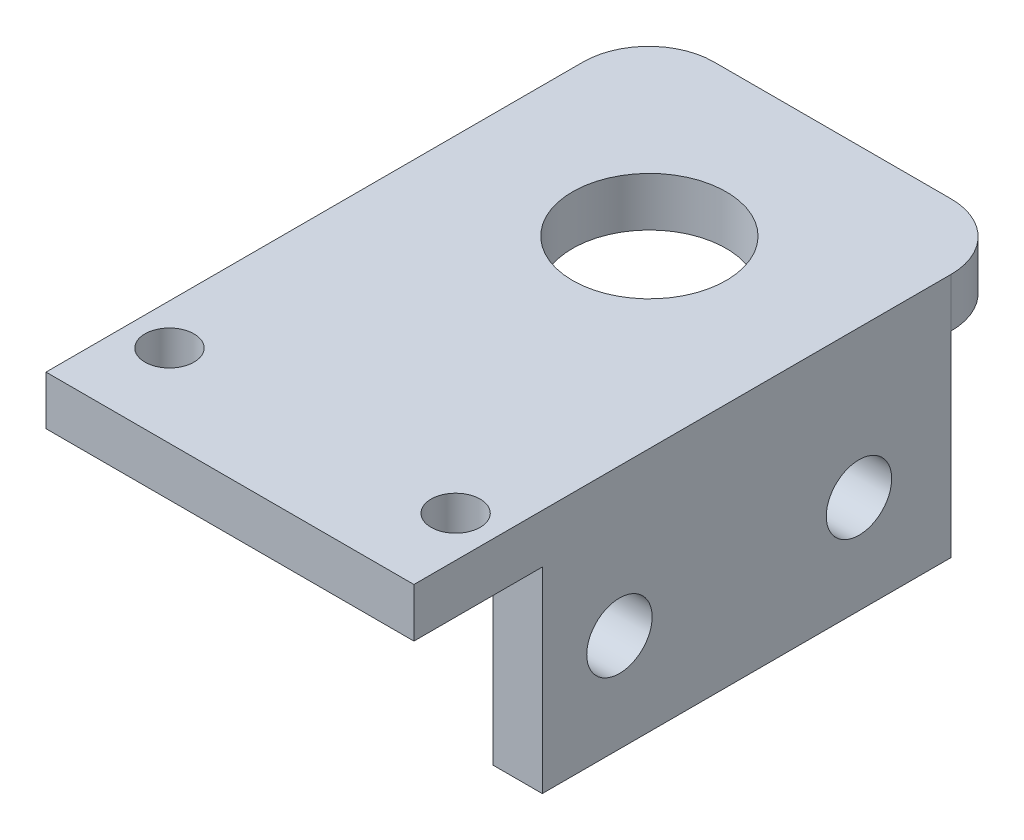
ISO-10303-21;
HEADER;
FILE_DESCRIPTION(('STEP AP214'),'2;1');
FILE_NAME('part.step','',(''),(''),'','','');
FILE_SCHEMA(('AUTOMOTIVE_DESIGN { 1 0 10303 214 1 1 1 1 }'));
ENDSEC;
DATA;
#1=APPLICATION_CONTEXT('core data for automotive mechanical design processes');
#2=APPLICATION_PROTOCOL_DEFINITION('international standard','automotive_design',2000,#1);
#3=PRODUCT_CONTEXT('',#1,'mechanical');
#4=PRODUCT('Part','Part','',(#3));
#5=PRODUCT_RELATED_PRODUCT_CATEGORY('part','',(#4));
#6=PRODUCT_DEFINITION_FORMATION('','',#4);
#7=PRODUCT_DEFINITION_CONTEXT('part definition',#1,'design');
#8=PRODUCT_DEFINITION('design','',#6,#7);
#9=PRODUCT_DEFINITION_SHAPE('','',#8);
#10=(LENGTH_UNIT() NAMED_UNIT(*) SI_UNIT(.MILLI.,.METRE.));
#11=(NAMED_UNIT(*) PLANE_ANGLE_UNIT() SI_UNIT($,.RADIAN.));
#12=(NAMED_UNIT(*) SI_UNIT($,.STERADIAN.) SOLID_ANGLE_UNIT());
#13=UNCERTAINTY_MEASURE_WITH_UNIT(LENGTH_MEASURE(1.E-05),#10,'distance_accuracy_value','');
#14=(GEOMETRIC_REPRESENTATION_CONTEXT(3) GLOBAL_UNCERTAINTY_ASSIGNED_CONTEXT((#13)) GLOBAL_UNIT_ASSIGNED_CONTEXT((#10,
#11,#12)) REPRESENTATION_CONTEXT('',''));
#15=CARTESIAN_POINT('',(0.,0.,0.));
#16=DIRECTION('',(0.,0.,1.));
#17=DIRECTION('',(1.,0.,0.));
#18=AXIS2_PLACEMENT_3D('',#15,#16,#17);
#19=CARTESIAN_POINT('',(21.0454809291478,3.,0.));
#20=DIRECTION('',(-1.,0.,0.));
#21=DIRECTION('',(0.,0.,1.));
#22=AXIS2_PLACEMENT_3D('',#19,#20,#21);
#23=PLANE('',#22);
#24=DIRECTION('',(0.,0.,-1.));
#25=VECTOR('',#24,1.);
#26=CARTESIAN_POINT('',(21.0454809291478,0.,0.));
#27=LINE('',#26,#25);
#28=CARTESIAN_POINT('',(21.0454809291478,0.,19.8927227898984));
#29=VERTEX_POINT('',#28);
#30=CARTESIAN_POINT('',(21.0454809291478,0.,12.0427227898984));
#31=VERTEX_POINT('',#30);
#32=EDGE_CURVE('E268',#29,#31,#27,.T.);
#33=ORIENTED_EDGE('',*,*,#32,.T.);
#34=DIRECTION('',(0.,-1.,0.));
#35=VECTOR('',#34,1.);
#36=CARTESIAN_POINT('',(21.0454809291478,0.,12.0427227898984));
#37=LINE('',#36,#35);
#38=CARTESIAN_POINT('',(21.0454809291478,-12.,12.0427227898984));
#39=VERTEX_POINT('',#38);
#40=EDGE_CURVE('E203',#31,#39,#37,.T.);
#41=ORIENTED_EDGE('',*,*,#40,.T.);
#42=DIRECTION('',(0.,0.,1.));
#43=VECTOR('',#42,1.);
#44=CARTESIAN_POINT('',(21.0454809291478,-12.,0.));
#45=LINE('',#44,#43);
#46=CARTESIAN_POINT('',(21.0454809291478,-12.,-12.9572772101016));
#47=VERTEX_POINT('',#46);
#48=EDGE_CURVE('E190',#47,#39,#45,.T.);
#49=ORIENTED_EDGE('',*,*,#48,.F.);
#50=DIRECTION('',(0.,-1.,0.));
#51=VECTOR('',#50,1.);
#52=CARTESIAN_POINT('',(21.0454809291478,0.,-12.9572772101016));
#53=LINE('',#52,#51);
#54=CARTESIAN_POINT('',(21.0454809291478,0.,-12.9572772101016));
#55=VERTEX_POINT('',#54);
#56=EDGE_CURVE('E177',#55,#47,#53,.T.);
#57=ORIENTED_EDGE('',*,*,#56,.F.);
#58=DIRECTION('',(0.,-1.,0.));
#59=VECTOR('',#58,1.);
#60=CARTESIAN_POINT('',(21.0454809291478,3.,-12.9572772101016));
#61=LINE('',#60,#59);
#62=CARTESIAN_POINT('',(21.0454809291478,3.,-12.9572772101016));
#63=VERTEX_POINT('',#62);
#64=EDGE_CURVE('E11',#63,#55,#61,.T.);
#65=ORIENTED_EDGE('',*,*,#64,.F.);
#66=DIRECTION('',(0.,0.,-1.));
#67=VECTOR('',#66,1.);
#68=CARTESIAN_POINT('',(21.0454809291478,3.,0.));
#69=LINE('',#68,#67);
#70=CARTESIAN_POINT('',(21.0454809291478,3.,19.8927227898984));
#71=VERTEX_POINT('',#70);
#72=EDGE_CURVE('E237',#71,#63,#69,.T.);
#73=ORIENTED_EDGE('',*,*,#72,.F.);
#74=DIRECTION('',(0.,-1.,0.));
#75=VECTOR('',#74,1.);
#76=CARTESIAN_POINT('',(21.0454809291478,3.,19.8927227898984));
#77=LINE('',#76,#75);
#78=EDGE_CURVE('E256',#71,#29,#77,.T.);
#79=ORIENTED_EDGE('',*,*,#78,.T.);
#80=EDGE_LOOP('',(#33,#41,#49,#57,#65,#73,#79));
#81=FACE_BOUND('',#80,.T.);
#82=CARTESIAN_POINT('',(21.0454809291478,-6.,-7.32401908619473));
#83=DIRECTION('',(-1.,0.,0.));
#84=DIRECTION('',(0.,0.,1.));
#85=AXIS2_PLACEMENT_3D('',#82,#83,#84);
#86=CIRCLE('',#85,2.);
#87=CARTESIAN_POINT('',(21.0454809291478,-6.,-5.32401908619473));
#88=VERTEX_POINT('',#87);
#89=EDGE_CURVE('E182',#88,#88,#86,.F.);
#90=ORIENTED_EDGE('',*,*,#89,.F.);
#91=EDGE_LOOP('',(#90));
#92=FACE_BOUND('',#91,.T.);
#93=CARTESIAN_POINT('',(21.0454809291478,-6.,7.32401908619473));
#94=DIRECTION('',(-1.,0.,0.));
#95=DIRECTION('',(0.,0.,1.));
#96=AXIS2_PLACEMENT_3D('',#93,#94,#95);
#97=CIRCLE('',#96,2.);
#98=CARTESIAN_POINT('',(21.0454809291478,-6.,9.32401908619473));
#99=VERTEX_POINT('',#98);
#100=EDGE_CURVE('E173',#99,#99,#97,.T.);
#101=ORIENTED_EDGE('',*,*,#100,.T.);
#102=EDGE_LOOP('',(#101));
#103=FACE_BOUND('',#102,.T.);
#104=ADVANCED_FACE('F44',(#81,#92,#103),#23,.F.);
#105=CARTESIAN_POINT('',(18.0454809291478,0.,0.));
#106=DIRECTION('',(1.,0.,0.));
#107=DIRECTION('',(0.,0.,-1.));
#108=AXIS2_PLACEMENT_3D('',#105,#106,#107);
#109=PLANE('',#108);
#110=DIRECTION('',(0.,0.,-1.));
#111=VECTOR('',#110,1.);
#112=CARTESIAN_POINT('',(18.0454809291478,0.,0.));
#113=LINE('',#112,#111);
#114=CARTESIAN_POINT('',(18.0454809291478,0.,12.0427227898984));
#115=VERTEX_POINT('',#114);
#116=CARTESIAN_POINT('',(18.0454809291478,0.,3.54272278989844));
#117=VERTEX_POINT('',#116);
#118=EDGE_CURVE('E147',#115,#117,#113,.T.);
#119=ORIENTED_EDGE('',*,*,#118,.T.);
#120=DIRECTION('',(0.,1.,0.));
#121=VECTOR('',#120,1.);
#122=CARTESIAN_POINT('',(18.0454809291478,0.,3.54272278989844));
#123=LINE('',#122,#121);
#124=CARTESIAN_POINT('',(18.0454809291478,-4.6412135438896,3.54272278989844));
#125=VERTEX_POINT('',#124);
#126=EDGE_CURVE('E60',#125,#117,#123,.T.);
#127=ORIENTED_EDGE('',*,*,#126,.F.);
#128=DIRECTION('',(0.,0.,-1.));
#129=VECTOR('',#128,1.);
#130=CARTESIAN_POINT('',(18.0454809291478,-4.6412135438896,3.54272278989844));
#131=LINE('',#130,#129);
#132=CARTESIAN_POINT('',(18.0454809291478,-4.6412135438896,0.542722789898435));
#133=VERTEX_POINT('',#132);
#134=EDGE_CURVE('E65',#125,#133,#131,.T.);
#135=ORIENTED_EDGE('',*,*,#134,.T.);
#136=DIRECTION('',(0.,1.,0.));
#137=VECTOR('',#136,1.);
#138=CARTESIAN_POINT('',(18.0454809291478,0.,0.542722789898435));
#139=LINE('',#138,#137);
#140=CARTESIAN_POINT('',(18.0454809291478,0.,0.542722789898435));
#141=VERTEX_POINT('',#140);
#142=EDGE_CURVE('E151',#133,#141,#139,.T.);
#143=ORIENTED_EDGE('',*,*,#142,.T.);
#144=CARTESIAN_POINT('',(18.0454809291478,0.,-12.9572772101016));
#145=VERTEX_POINT('',#144);
#146=EDGE_CURVE('E137',#141,#145,#113,.T.);
#147=ORIENTED_EDGE('',*,*,#146,.T.);
#148=DIRECTION('',(0.,-1.,0.));
#149=VECTOR('',#148,1.);
#150=CARTESIAN_POINT('',(18.0454809291478,0.,-12.9572772101016));
#151=LINE('',#150,#149);
#152=CARTESIAN_POINT('',(18.0454809291478,-12.,-12.9572772101016));
#153=VERTEX_POINT('',#152);
#154=EDGE_CURVE('E148',#145,#153,#151,.T.);
#155=ORIENTED_EDGE('',*,*,#154,.T.);
#156=DIRECTION('',(0.,0.,1.));
#157=VECTOR('',#156,1.);
#158=CARTESIAN_POINT('',(18.0454809291478,-12.,0.));
#159=LINE('',#158,#157);
#160=CARTESIAN_POINT('',(18.0454809291478,-12.,12.0427227898984));
#161=VERTEX_POINT('',#160);
#162=EDGE_CURVE('E197',#153,#161,#159,.T.);
#163=ORIENTED_EDGE('',*,*,#162,.T.);
#164=DIRECTION('',(0.,-1.,0.));
#165=VECTOR('',#164,1.);
#166=CARTESIAN_POINT('',(18.0454809291478,0.,12.0427227898984));
#167=LINE('',#166,#165);
#168=EDGE_CURVE('E193',#115,#161,#167,.T.);
#169=ORIENTED_EDGE('',*,*,#168,.F.);
#170=EDGE_LOOP('',(#119,#127,#135,#143,#147,#155,#163,#169));
#171=FACE_BOUND('',#170,.T.);
#172=CARTESIAN_POINT('',(18.0454809291478,-6.,-7.32401908619473));
#173=DIRECTION('',(-1.,0.,0.));
#174=DIRECTION('',(0.,0.,1.));
#175=AXIS2_PLACEMENT_3D('',#172,#173,#174);
#176=CIRCLE('',#175,2.);
#177=CARTESIAN_POINT('',(18.0454809291478,-6.,-5.32401908619473));
#178=VERTEX_POINT('',#177);
#179=EDGE_CURVE('E172',#178,#178,#176,.F.);
#180=ORIENTED_EDGE('',*,*,#179,.T.);
#181=EDGE_LOOP('',(#180));
#182=FACE_BOUND('',#181,.T.);
#183=CARTESIAN_POINT('',(18.0454809291478,-6.,7.32401908619473));
#184=DIRECTION('',(-1.,0.,0.));
#185=DIRECTION('',(0.,0.,1.));
#186=AXIS2_PLACEMENT_3D('',#183,#184,#185);
#187=CIRCLE('',#186,2.);
#188=CARTESIAN_POINT('',(18.0454809291478,-6.,9.32401908619473));
#189=VERTEX_POINT('',#188);
#190=EDGE_CURVE('E178',#189,#189,#187,.T.);
#191=ORIENTED_EDGE('',*,*,#190,.F.);
#192=EDGE_LOOP('',(#191));
#193=FACE_BOUND('',#192,.T.);
#194=ADVANCED_FACE('F152',(#171,#182,#193),#109,.F.);
#195=CARTESIAN_POINT('',(0.,0.,0.));
#196=DIRECTION('',(0.,1.,0.));
#197=DIRECTION('',(0.,0.,1.));
#198=AXIS2_PLACEMENT_3D('',#195,#196,#197);
#199=PLANE('',#198);
#200=CARTESIAN_POINT('',(18.5454809291478,0.,14.8427227898984));
#201=DIRECTION('',(0.,1.,0.));
#202=DIRECTION('',(0.,0.,1.));
#203=AXIS2_PLACEMENT_3D('',#200,#201,#202);
#204=CIRCLE('',#203,1.5);
#205=CARTESIAN_POINT('',(18.5454809291478,0.,16.3427227898984));
#206=VERTEX_POINT('',#205);
#207=EDGE_CURVE('E264',#206,#206,#204,.T.);
#208=ORIENTED_EDGE('',*,*,#207,.T.);
#209=EDGE_LOOP('',(#208));
#210=FACE_BOUND('',#209,.T.);
#211=CARTESIAN_POINT('',(1.04548092914784,0.,14.8427227898984));
#212=DIRECTION('',(0.,1.,0.));
#213=DIRECTION('',(0.,0.,1.));
#214=AXIS2_PLACEMENT_3D('',#211,#212,#213);
#215=CIRCLE('',#214,1.5);
#216=CARTESIAN_POINT('',(1.04548092914784,0.,16.3427227898984));
#217=VERTEX_POINT('',#216);
#218=EDGE_CURVE('E260',#217,#217,#215,.T.);
#219=ORIENTED_EDGE('',*,*,#218,.T.);
#220=EDGE_LOOP('',(#219));
#221=FACE_BOUND('',#220,.T.);
#222=CARTESIAN_POINT('',(9.79548092914784,0.,-5.75727721010157));
#223=DIRECTION('',(0.,1.,0.));
#224=DIRECTION('',(0.,0.,1.));
#225=AXIS2_PLACEMENT_3D('',#222,#223,#224);
#226=CIRCLE('',#225,4.7);
#227=CARTESIAN_POINT('',(9.79548092914784,0.,-1.05727721010157));
#228=VERTEX_POINT('',#227);
#229=EDGE_CURVE('E214',#228,#228,#226,.T.);
#230=ORIENTED_EDGE('',*,*,#229,.T.);
#231=EDGE_LOOP('',(#230));
#232=FACE_BOUND('',#231,.T.);
#233=DIRECTION('',(0.,0.,-1.));
#234=VECTOR('',#233,1.);
#235=CARTESIAN_POINT('',(11.0111979585973,0.,3.54272278989844));
#236=LINE('',#235,#234);
#237=CARTESIAN_POINT('',(11.0111979585973,0.,3.54272278989844));
#238=VERTEX_POINT('',#237);
#239=CARTESIAN_POINT('',(11.0111979585973,0.,0.542722789898435));
#240=VERTEX_POINT('',#239);
#241=EDGE_CURVE('E168',#238,#240,#236,.T.);
#242=ORIENTED_EDGE('',*,*,#241,.F.);
#243=DIRECTION('',(-1.,0.,0.));
#244=VECTOR('',#243,1.);
#245=CARTESIAN_POINT('',(11.0111979585973,0.,3.54272278989844));
#246=LINE('',#245,#244);
#247=EDGE_CURVE('E410',#117,#238,#246,.T.);
#248=ORIENTED_EDGE('',*,*,#247,.F.);
#249=ORIENTED_EDGE('',*,*,#118,.F.);
#250=DIRECTION('',(1.,0.,0.));
#251=VECTOR('',#250,1.);
#252=CARTESIAN_POINT('',(18.0454809291478,0.,12.0427227898984));
#253=LINE('',#252,#251);
#254=EDGE_CURVE('E218',#115,#31,#253,.T.);
#255=ORIENTED_EDGE('',*,*,#254,.T.);
#256=ORIENTED_EDGE('',*,*,#32,.F.);
#257=DIRECTION('',(1.,0.,0.));
#258=VECTOR('',#257,1.);
#259=CARTESIAN_POINT('',(0.,0.,19.8927227898984));
#260=LINE('',#259,#258);
#261=CARTESIAN_POINT('',(-1.45451907085216,0.,19.8927227898984));
#262=VERTEX_POINT('',#261);
#263=EDGE_CURVE('E229',#262,#29,#260,.T.);
#264=ORIENTED_EDGE('',*,*,#263,.F.);
#265=DIRECTION('',(0.,0.,1.));
#266=VECTOR('',#265,1.);
#267=CARTESIAN_POINT('',(-1.45451907085216,0.,0.));
#268=LINE('',#267,#266);
#269=CARTESIAN_POINT('',(-1.45451907085216,0.,-12.9572772101016));
#270=VERTEX_POINT('',#269);
#271=EDGE_CURVE('E281',#270,#262,#268,.T.);
#272=ORIENTED_EDGE('',*,*,#271,.F.);
#273=CARTESIAN_POINT('',(2.54548092914784,0.,-12.9572772101016));
#274=DIRECTION('',(0.,1.,0.));
#275=DIRECTION('',(0.,0.,1.));
#276=AXIS2_PLACEMENT_3D('',#273,#274,#275);
#277=CIRCLE('',#276,4.);
#278=CARTESIAN_POINT('',(2.54548092914784,0.,-16.9572772101016));
#279=VERTEX_POINT('',#278);
#280=EDGE_CURVE('E278',#279,#270,#277,.T.);
#281=ORIENTED_EDGE('',*,*,#280,.F.);
#282=DIRECTION('',(-1.,0.,0.));
#283=VECTOR('',#282,1.);
#284=CARTESIAN_POINT('',(0.,0.,-16.9572772101016));
#285=LINE('',#284,#283);
#286=CARTESIAN_POINT('',(17.0454809291478,0.,-16.9572772101016));
#287=VERTEX_POINT('',#286);
#288=EDGE_CURVE('E275',#287,#279,#285,.T.);
#289=ORIENTED_EDGE('',*,*,#288,.F.);
#290=CARTESIAN_POINT('',(17.0454809291478,0.,-12.9572772101016));
#291=DIRECTION('',(0.,1.,0.));
#292=DIRECTION('',(0.,0.,1.));
#293=AXIS2_PLACEMENT_3D('',#290,#291,#292);
#294=CIRCLE('',#293,4.);
#295=EDGE_CURVE('E272',#55,#287,#294,.T.);
#296=ORIENTED_EDGE('',*,*,#295,.F.);
#297=DIRECTION('',(1.,0.,0.));
#298=VECTOR('',#297,1.);
#299=CARTESIAN_POINT('',(18.0454809291478,0.,-12.9572772101016));
#300=LINE('',#299,#298);
#301=EDGE_CURVE('E143',#145,#55,#300,.T.);
#302=ORIENTED_EDGE('',*,*,#301,.F.);
#303=ORIENTED_EDGE('',*,*,#146,.F.);
#304=DIRECTION('',(-1.,0.,0.));
#305=VECTOR('',#304,1.);
#306=CARTESIAN_POINT('',(11.0111979585973,0.,0.542722789898435));
#307=LINE('',#306,#305);
#308=EDGE_CURVE('E140',#141,#240,#307,.T.);
#309=ORIENTED_EDGE('',*,*,#308,.T.);
#310=EDGE_LOOP('',(#242,#248,#249,#255,#256,#264,#272,#281,#289,#296,#302,#303,#309));
#311=FACE_BOUND('',#310,.T.);
#312=ADVANCED_FACE('F138',(#210,#221,#232,#311),#199,.F.);
#313=CARTESIAN_POINT('',(17.0454809291478,3.,-12.9572772101016));
#314=DIRECTION('',(0.,-1.,0.));
#315=DIRECTION('',(0.,0.,-1.));
#316=AXIS2_PLACEMENT_3D('',#313,#314,#315);
#317=CYLINDRICAL_SURFACE('',#316,4.);
#318=ORIENTED_EDGE('',*,*,#295,.T.);
#319=DIRECTION('',(0.,-1.,0.));
#320=VECTOR('',#319,1.);
#321=CARTESIAN_POINT('',(17.0454809291478,3.,-16.9572772101016));
#322=LINE('',#321,#320);
#323=CARTESIAN_POINT('',(17.0454809291478,3.,-16.9572772101016));
#324=VERTEX_POINT('',#323);
#325=EDGE_CURVE('E53',#324,#287,#322,.T.);
#326=ORIENTED_EDGE('',*,*,#325,.F.);
#327=CARTESIAN_POINT('',(17.0454809291478,3.,-12.9572772101016));
#328=DIRECTION('',(0.,1.,0.));
#329=DIRECTION('',(0.,0.,1.));
#330=AXIS2_PLACEMENT_3D('',#327,#328,#329);
#331=CIRCLE('',#330,4.);
#332=EDGE_CURVE('E241',#63,#324,#331,.T.);
#333=ORIENTED_EDGE('',*,*,#332,.F.);
#334=ORIENTED_EDGE('',*,*,#64,.T.);
#335=EDGE_LOOP('',(#318,#326,#333,#334));
#336=FACE_BOUND('',#335,.T.);
#337=ADVANCED_FACE('F326',(#336),#317,.T.);
#338=CARTESIAN_POINT('',(0.,3.,-16.9572772101016));
#339=DIRECTION('',(0.,0.,1.));
#340=DIRECTION('',(1.,0.,0.));
#341=AXIS2_PLACEMENT_3D('',#338,#339,#340);
#342=PLANE('',#341);
#343=ORIENTED_EDGE('',*,*,#288,.T.);
#344=DIRECTION('',(0.,-1.,0.));
#345=VECTOR('',#344,1.);
#346=CARTESIAN_POINT('',(2.54548092914784,3.,-16.9572772101016));
#347=LINE('',#346,#345);
#348=CARTESIAN_POINT('',(2.54548092914784,3.,-16.9572772101016));
#349=VERTEX_POINT('',#348);
#350=EDGE_CURVE('E297',#349,#279,#347,.T.);
#351=ORIENTED_EDGE('',*,*,#350,.F.);
#352=DIRECTION('',(-1.,0.,0.));
#353=VECTOR('',#352,1.);
#354=CARTESIAN_POINT('',(0.,3.,-16.9572772101016));
#355=LINE('',#354,#353);
#356=EDGE_CURVE('E244',#324,#349,#355,.T.);
#357=ORIENTED_EDGE('',*,*,#356,.F.);
#358=ORIENTED_EDGE('',*,*,#325,.T.);
#359=EDGE_LOOP('',(#343,#351,#357,#358));
#360=FACE_BOUND('',#359,.T.);
#361=ADVANCED_FACE('F306',(#360),#342,.F.);
#362=CARTESIAN_POINT('',(2.54548092914784,3.,-12.9572772101016));
#363=DIRECTION('',(0.,-1.,0.));
#364=DIRECTION('',(0.,0.,-1.));
#365=AXIS2_PLACEMENT_3D('',#362,#363,#364);
#366=CYLINDRICAL_SURFACE('',#365,4.);
#367=ORIENTED_EDGE('',*,*,#280,.T.);
#368=DIRECTION('',(0.,-1.,0.));
#369=VECTOR('',#368,1.);
#370=CARTESIAN_POINT('',(-1.45451907085216,3.,-12.9572772101016));
#371=LINE('',#370,#369);
#372=CARTESIAN_POINT('',(-1.45451907085216,3.,-12.9572772101016));
#373=VERTEX_POINT('',#372);
#374=EDGE_CURVE('E293',#373,#270,#371,.T.);
#375=ORIENTED_EDGE('',*,*,#374,.F.);
#376=CARTESIAN_POINT('',(2.54548092914784,3.,-12.9572772101016));
#377=DIRECTION('',(0.,1.,0.));
#378=DIRECTION('',(0.,0.,1.));
#379=AXIS2_PLACEMENT_3D('',#376,#377,#378);
#380=CIRCLE('',#379,4.);
#381=EDGE_CURVE('E247',#349,#373,#380,.T.);
#382=ORIENTED_EDGE('',*,*,#381,.F.);
#383=ORIENTED_EDGE('',*,*,#350,.T.);
#384=EDGE_LOOP('',(#367,#375,#382,#383));
#385=FACE_BOUND('',#384,.T.);
#386=ADVANCED_FACE('F314',(#385),#366,.T.);
#387=CARTESIAN_POINT('',(-1.45451907085216,3.,0.));
#388=DIRECTION('',(1.,0.,0.));
#389=DIRECTION('',(0.,0.,-1.));
#390=AXIS2_PLACEMENT_3D('',#387,#388,#389);
#391=PLANE('',#390);
#392=ORIENTED_EDGE('',*,*,#271,.T.);
#393=DIRECTION('',(0.,-1.,0.));
#394=VECTOR('',#393,1.);
#395=CARTESIAN_POINT('',(-1.45451907085216,3.,19.8927227898984));
#396=LINE('',#395,#394);
#397=CARTESIAN_POINT('',(-1.45451907085216,3.,19.8927227898984));
#398=VERTEX_POINT('',#397);
#399=EDGE_CURVE('E289',#398,#262,#396,.T.);
#400=ORIENTED_EDGE('',*,*,#399,.F.);
#401=DIRECTION('',(0.,0.,1.));
#402=VECTOR('',#401,1.);
#403=CARTESIAN_POINT('',(-1.45451907085216,3.,0.));
#404=LINE('',#403,#402);
#405=EDGE_CURVE('E250',#373,#398,#404,.T.);
#406=ORIENTED_EDGE('',*,*,#405,.F.);
#407=ORIENTED_EDGE('',*,*,#374,.T.);
#408=EDGE_LOOP('',(#392,#400,#406,#407));
#409=FACE_BOUND('',#408,.T.);
#410=ADVANCED_FACE('F318',(#409),#391,.F.);
#411=CARTESIAN_POINT('',(18.5454809291478,3.,14.8427227898984));
#412=DIRECTION('',(0.,-1.,0.));
#413=DIRECTION('',(0.,0.,-1.));
#414=AXIS2_PLACEMENT_3D('',#411,#412,#413);
#415=CYLINDRICAL_SURFACE('',#414,1.5);
#416=CARTESIAN_POINT('',(18.5454809291478,3.,14.8427227898984));
#417=DIRECTION('',(0.,1.,0.));
#418=DIRECTION('',(0.,0.,1.));
#419=AXIS2_PLACEMENT_3D('',#416,#417,#418);
#420=CIRCLE('',#419,1.5);
#421=CARTESIAN_POINT('',(18.5454809291478,3.,16.3427227898984));
#422=VERTEX_POINT('',#421);
#423=EDGE_CURVE('E233',#422,#422,#420,.T.);
#424=ORIENTED_EDGE('',*,*,#423,.T.);
#425=EDGE_LOOP('',(#424));
#426=FACE_BOUND('',#425,.T.);
#427=ORIENTED_EDGE('',*,*,#207,.F.);
#428=EDGE_LOOP('',(#427));
#429=FACE_BOUND('',#428,.T.);
#430=ADVANCED_FACE('F364',(#426,#429),#415,.F.);
#431=CARTESIAN_POINT('',(1.04548092914784,3.,14.8427227898984));
#432=DIRECTION('',(0.,-1.,0.));
#433=DIRECTION('',(0.,0.,-1.));
#434=AXIS2_PLACEMENT_3D('',#431,#432,#433);
#435=CYLINDRICAL_SURFACE('',#434,1.5);
#436=CARTESIAN_POINT('',(1.04548092914784,3.,14.8427227898984));
#437=DIRECTION('',(0.,1.,0.));
#438=DIRECTION('',(0.,0.,1.));
#439=AXIS2_PLACEMENT_3D('',#436,#437,#438);
#440=CIRCLE('',#439,1.5);
#441=CARTESIAN_POINT('',(1.04548092914784,3.,16.3427227898984));
#442=VERTEX_POINT('',#441);
#443=EDGE_CURVE('E228',#442,#442,#440,.T.);
#444=ORIENTED_EDGE('',*,*,#443,.T.);
#445=EDGE_LOOP('',(#444));
#446=FACE_BOUND('',#445,.T.);
#447=ORIENTED_EDGE('',*,*,#218,.F.);
#448=EDGE_LOOP('',(#447));
#449=FACE_BOUND('',#448,.T.);
#450=ADVANCED_FACE('F351',(#446,#449),#435,.F.);
#451=CARTESIAN_POINT('',(9.79548092914784,3.,-5.75727721010157));
#452=DIRECTION('',(0.,-1.,0.));
#453=DIRECTION('',(0.,0.,-1.));
#454=AXIS2_PLACEMENT_3D('',#451,#452,#453);
#455=CYLINDRICAL_SURFACE('',#454,4.7);
#456=CARTESIAN_POINT('',(9.79548092914784,3.,-5.75727721010157));
#457=DIRECTION('',(0.,1.,0.));
#458=DIRECTION('',(0.,0.,1.));
#459=AXIS2_PLACEMENT_3D('',#456,#457,#458);
#460=CIRCLE('',#459,4.7);
#461=CARTESIAN_POINT('',(9.79548092914784,3.,-1.05727721010157));
#462=VERTEX_POINT('',#461);
#463=EDGE_CURVE('E224',#462,#462,#460,.T.);
#464=ORIENTED_EDGE('',*,*,#463,.T.);
#465=EDGE_LOOP('',(#464));
#466=FACE_BOUND('',#465,.T.);
#467=ORIENTED_EDGE('',*,*,#229,.F.);
#468=EDGE_LOOP('',(#467));
#469=FACE_BOUND('',#468,.T.);
#470=ADVANCED_FACE('F46',(#466,#469),#455,.F.);
#471=CARTESIAN_POINT('',(0.,3.,19.8927227898984));
#472=DIRECTION('',(0.,0.,-1.));
#473=DIRECTION('',(-1.,0.,0.));
#474=AXIS2_PLACEMENT_3D('',#471,#472,#473);
#475=PLANE('',#474);
#476=ORIENTED_EDGE('',*,*,#263,.T.);
#477=ORIENTED_EDGE('',*,*,#78,.F.);
#478=DIRECTION('',(1.,0.,0.));
#479=VECTOR('',#478,1.);
#480=CARTESIAN_POINT('',(0.,3.,19.8927227898984));
#481=LINE('',#480,#479);
#482=EDGE_CURVE('E253',#398,#71,#481,.T.);
#483=ORIENTED_EDGE('',*,*,#482,.F.);
#484=ORIENTED_EDGE('',*,*,#399,.T.);
#485=EDGE_LOOP('',(#476,#477,#483,#484));
#486=FACE_BOUND('',#485,.T.);
#487=ADVANCED_FACE('F342',(#486),#475,.F.);
#488=CARTESIAN_POINT('',(0.,3.,0.));
#489=DIRECTION('',(0.,1.,0.));
#490=DIRECTION('',(0.,0.,1.));
#491=AXIS2_PLACEMENT_3D('',#488,#489,#490);
#492=PLANE('',#491);
#493=ORIENTED_EDGE('',*,*,#463,.F.);
#494=EDGE_LOOP('',(#493));
#495=FACE_BOUND('',#494,.T.);
#496=ORIENTED_EDGE('',*,*,#443,.F.);
#497=EDGE_LOOP('',(#496));
#498=FACE_BOUND('',#497,.T.);
#499=ORIENTED_EDGE('',*,*,#423,.F.);
#500=EDGE_LOOP('',(#499));
#501=FACE_BOUND('',#500,.T.);
#502=ORIENTED_EDGE('',*,*,#72,.T.);
#503=ORIENTED_EDGE('',*,*,#332,.T.);
#504=ORIENTED_EDGE('',*,*,#356,.T.);
#505=ORIENTED_EDGE('',*,*,#381,.T.);
#506=ORIENTED_EDGE('',*,*,#405,.T.);
#507=ORIENTED_EDGE('',*,*,#482,.T.);
#508=EDGE_LOOP('',(#502,#503,#504,#505,#506,#507));
#509=FACE_BOUND('',#508,.T.);
#510=ADVANCED_FACE('F322',(#495,#498,#501,#509),#492,.T.);
#511=CARTESIAN_POINT('',(18.0454809291478,0.,-12.9572772101016));
#512=DIRECTION('',(0.,0.,1.));
#513=DIRECTION('',(1.,0.,0.));
#514=AXIS2_PLACEMENT_3D('',#511,#512,#513);
#515=PLANE('',#514);
#516=ORIENTED_EDGE('',*,*,#56,.T.);
#517=DIRECTION('',(1.,0.,0.));
#518=VECTOR('',#517,1.);
#519=CARTESIAN_POINT('',(18.0454809291478,-12.,-12.9572772101016));
#520=LINE('',#519,#518);
#521=EDGE_CURVE('E210',#153,#47,#520,.T.);
#522=ORIENTED_EDGE('',*,*,#521,.F.);
#523=ORIENTED_EDGE('',*,*,#154,.F.);
#524=ORIENTED_EDGE('',*,*,#301,.T.);
#525=EDGE_LOOP('',(#516,#522,#523,#524));
#526=FACE_BOUND('',#525,.T.);
#527=ADVANCED_FACE('F332',(#526),#515,.F.);
#528=CARTESIAN_POINT('',(18.0454809291478,-12.,0.));
#529=DIRECTION('',(0.,1.,0.));
#530=DIRECTION('',(0.,0.,1.));
#531=AXIS2_PLACEMENT_3D('',#528,#529,#530);
#532=PLANE('',#531);
#533=ORIENTED_EDGE('',*,*,#48,.T.);
#534=DIRECTION('',(1.,0.,0.));
#535=VECTOR('',#534,1.);
#536=CARTESIAN_POINT('',(18.0454809291478,-12.,12.0427227898984));
#537=LINE('',#536,#535);
#538=EDGE_CURVE('E215',#161,#39,#537,.T.);
#539=ORIENTED_EDGE('',*,*,#538,.F.);
#540=ORIENTED_EDGE('',*,*,#162,.F.);
#541=ORIENTED_EDGE('',*,*,#521,.T.);
#542=EDGE_LOOP('',(#533,#539,#540,#541));
#543=FACE_BOUND('',#542,.T.);
#544=ADVANCED_FACE('F337',(#543),#532,.F.);
#545=CARTESIAN_POINT('',(18.0454809291478,0.,12.0427227898984));
#546=DIRECTION('',(0.,0.,1.));
#547=DIRECTION('',(1.,0.,0.));
#548=AXIS2_PLACEMENT_3D('',#545,#546,#547);
#549=PLANE('',#548);
#550=ORIENTED_EDGE('',*,*,#40,.F.);
#551=ORIENTED_EDGE('',*,*,#254,.F.);
#552=ORIENTED_EDGE('',*,*,#168,.T.);
#553=ORIENTED_EDGE('',*,*,#538,.T.);
#554=EDGE_LOOP('',(#550,#551,#552,#553));
#555=FACE_BOUND('',#554,.T.);
#556=ADVANCED_FACE('F339',(#555),#549,.T.);
#557=CARTESIAN_POINT('',(21.0454809291478,-6.,-7.32401908619473));
#558=DIRECTION('',(-1.,0.,0.));
#559=DIRECTION('',(0.,0.,1.));
#560=AXIS2_PLACEMENT_3D('',#557,#558,#559);
#561=CYLINDRICAL_SURFACE('',#560,2.);
#562=ORIENTED_EDGE('',*,*,#89,.T.);
#563=EDGE_LOOP('',(#562));
#564=FACE_BOUND('',#563,.T.);
#565=ORIENTED_EDGE('',*,*,#179,.F.);
#566=EDGE_LOOP('',(#565));
#567=FACE_BOUND('',#566,.T.);
#568=ADVANCED_FACE('F388',(#564,#567),#561,.F.);
#569=CARTESIAN_POINT('',(21.0454809291478,-6.,7.32401908619473));
#570=DIRECTION('',(-1.,0.,0.));
#571=DIRECTION('',(0.,0.,1.));
#572=AXIS2_PLACEMENT_3D('',#569,#570,#571);
#573=CYLINDRICAL_SURFACE('',#572,2.);
#574=ORIENTED_EDGE('',*,*,#100,.F.);
#575=EDGE_LOOP('',(#574));
#576=FACE_BOUND('',#575,.T.);
#577=ORIENTED_EDGE('',*,*,#190,.T.);
#578=EDGE_LOOP('',(#577));
#579=FACE_BOUND('',#578,.T.);
#580=ADVANCED_FACE('F393',(#576,#579),#573,.F.);
#581=CARTESIAN_POINT('',(18.0454809291478,-4.6412135438896,3.54272278989844));
#582=DIRECTION('',(0.550725393250466,0.834686492779846,0.));
#583=DIRECTION('',(-0.834686492779846,0.550725393250466,0.));
#584=AXIS2_PLACEMENT_3D('',#581,#582,#583);
#585=PLANE('',#584);
#586=DIRECTION('',(0.834686492779846,-0.550725393250466,0.));
#587=VECTOR('',#586,1.);
#588=CARTESIAN_POINT('',(18.0454809291478,-4.6412135438896,0.542722789898435));
#589=LINE('',#588,#587);
#590=EDGE_CURVE('E159',#240,#133,#589,.T.);
#591=ORIENTED_EDGE('',*,*,#590,.T.);
#592=ORIENTED_EDGE('',*,*,#134,.F.);
#593=DIRECTION('',(0.834686492779846,-0.550725393250466,0.));
#594=VECTOR('',#593,1.);
#595=CARTESIAN_POINT('',(18.0454809291478,-4.6412135438896,3.54272278989844));
#596=LINE('',#595,#594);
#597=EDGE_CURVE('E169',#238,#125,#596,.T.);
#598=ORIENTED_EDGE('',*,*,#597,.F.);
#599=ORIENTED_EDGE('',*,*,#241,.T.);
#600=EDGE_LOOP('',(#591,#592,#598,#599));
#601=FACE_BOUND('',#600,.T.);
#602=ADVANCED_FACE('F397',(#601),#585,.F.);
#603=CARTESIAN_POINT('',(0.,0.,3.54272278989844));
#604=DIRECTION('',(0.,0.,1.));
#605=DIRECTION('',(1.,0.,0.));
#606=AXIS2_PLACEMENT_3D('',#603,#604,#605);
#607=PLANE('',#606);
#608=ORIENTED_EDGE('',*,*,#126,.T.);
#609=ORIENTED_EDGE('',*,*,#247,.T.);
#610=ORIENTED_EDGE('',*,*,#597,.T.);
#611=EDGE_LOOP('',(#608,#609,#610));
#612=FACE_BOUND('',#611,.T.);
#613=ADVANCED_FACE('F401',(#612),#607,.T.);
#614=CARTESIAN_POINT('',(0.,0.,0.542722789898435));
#615=DIRECTION('',(0.,0.,1.));
#616=DIRECTION('',(1.,0.,0.));
#617=AXIS2_PLACEMENT_3D('',#614,#615,#616);
#618=PLANE('',#617);
#619=ORIENTED_EDGE('',*,*,#142,.F.);
#620=ORIENTED_EDGE('',*,*,#590,.F.);
#621=ORIENTED_EDGE('',*,*,#308,.F.);
#622=EDGE_LOOP('',(#619,#620,#621));
#623=FACE_BOUND('',#622,.T.);
#624=ADVANCED_FACE('F158',(#623),#618,.F.);
#625=CLOSED_SHELL('',(#104,#194,#312,#337,#361,#386,#410,#430,#450,#470,#487,#510,#527,#544,
#556,#568,#580,#602,#613,#624));
#626=MANIFOLD_SOLID_BREP('B2',#625);
#627=ADVANCED_BREP_SHAPE_REPRESENTATION('',(#18,#626),#14);
#628=SHAPE_DEFINITION_REPRESENTATION(#9,#627);
ENDSEC;
END-ISO-10303-21;
